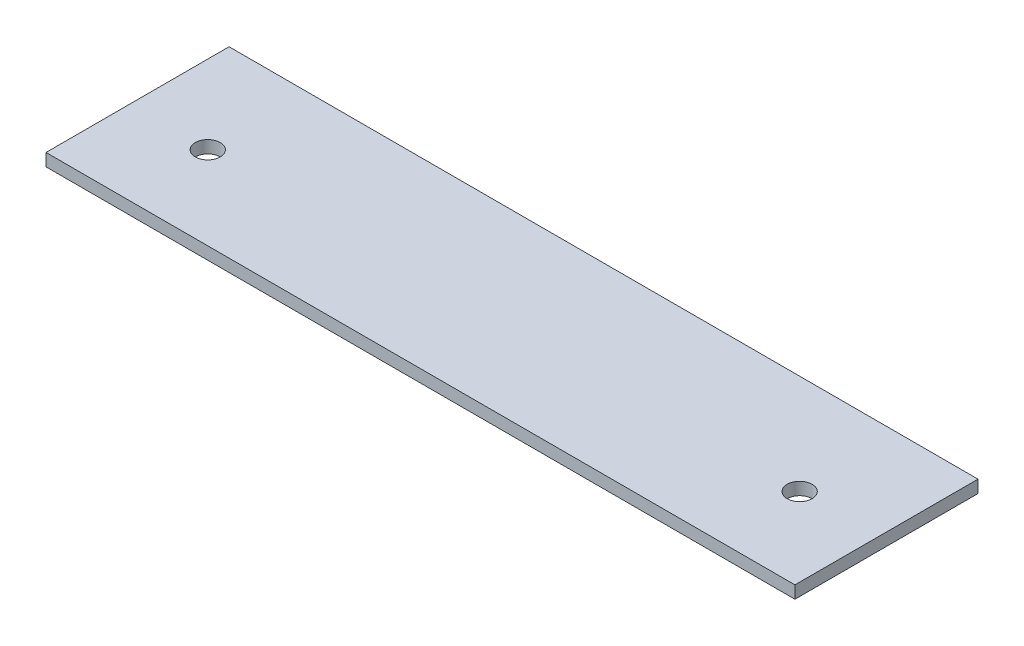
ISO-10303-21;
HEADER;
FILE_DESCRIPTION(('STEP AP214'),'2;1');
FILE_NAME('part.step','',(''),(''),'','','');
FILE_SCHEMA(('AUTOMOTIVE_DESIGN { 1 0 10303 214 1 1 1 1 }'));
ENDSEC;
DATA;
#1=APPLICATION_CONTEXT('core data for automotive mechanical design processes');
#2=APPLICATION_PROTOCOL_DEFINITION('international standard','automotive_design',2000,#1);
#3=PRODUCT_CONTEXT('',#1,'mechanical');
#4=PRODUCT('Part','Part','',(#3));
#5=PRODUCT_RELATED_PRODUCT_CATEGORY('part','',(#4));
#6=PRODUCT_DEFINITION_FORMATION('','',#4);
#7=PRODUCT_DEFINITION_CONTEXT('part definition',#1,'design');
#8=PRODUCT_DEFINITION('design','',#6,#7);
#9=PRODUCT_DEFINITION_SHAPE('','',#8);
#10=(LENGTH_UNIT() NAMED_UNIT(*) SI_UNIT(.MILLI.,.METRE.));
#11=(NAMED_UNIT(*) PLANE_ANGLE_UNIT() SI_UNIT($,.RADIAN.));
#12=(NAMED_UNIT(*) SI_UNIT($,.STERADIAN.) SOLID_ANGLE_UNIT());
#13=UNCERTAINTY_MEASURE_WITH_UNIT(LENGTH_MEASURE(1.E-05),#10,'distance_accuracy_value','');
#14=(GEOMETRIC_REPRESENTATION_CONTEXT(3) GLOBAL_UNCERTAINTY_ASSIGNED_CONTEXT((#13)) GLOBAL_UNIT_ASSIGNED_CONTEXT((#10,
#11,#12)) REPRESENTATION_CONTEXT('',''));
#15=CARTESIAN_POINT('',(0.,0.,0.));
#16=DIRECTION('',(0.,0.,1.));
#17=DIRECTION('',(1.,0.,0.));
#18=AXIS2_PLACEMENT_3D('',#15,#16,#17);
#19=CARTESIAN_POINT('',(0.,-1.5,11.));
#20=DIRECTION('',(0.,0.,1.));
#21=DIRECTION('',(1.,0.,0.));
#22=AXIS2_PLACEMENT_3D('',#19,#20,#21);
#23=PLANE('',#22);
#24=DIRECTION('',(1.,0.,0.));
#25=VECTOR('',#24,1.);
#26=CARTESIAN_POINT('',(0.,0.,11.));
#27=LINE('',#26,#25);
#28=CARTESIAN_POINT('',(-45.,0.,11.));
#29=VERTEX_POINT('',#28);
#30=CARTESIAN_POINT('',(45.,0.,11.));
#31=VERTEX_POINT('',#30);
#32=EDGE_CURVE('E112',#29,#31,#27,.T.);
#33=ORIENTED_EDGE('',*,*,#32,.F.);
#34=DIRECTION('',(0.,1.,0.));
#35=VECTOR('',#34,1.);
#36=CARTESIAN_POINT('',(-45.,-1.5,11.));
#37=LINE('',#36,#35);
#38=CARTESIAN_POINT('',(-45.,-1.5,11.));
#39=VERTEX_POINT('',#38);
#40=EDGE_CURVE('E11',#39,#29,#37,.T.);
#41=ORIENTED_EDGE('',*,*,#40,.F.);
#42=DIRECTION('',(1.,0.,0.));
#43=VECTOR('',#42,1.);
#44=CARTESIAN_POINT('',(0.,-1.5,11.));
#45=LINE('',#44,#43);
#46=CARTESIAN_POINT('',(45.,-1.5,11.));
#47=VERTEX_POINT('',#46);
#48=EDGE_CURVE('E100',#39,#47,#45,.T.);
#49=ORIENTED_EDGE('',*,*,#48,.T.);
#50=DIRECTION('',(0.,1.,0.));
#51=VECTOR('',#50,1.);
#52=CARTESIAN_POINT('',(45.,-1.5,11.));
#53=LINE('',#52,#51);
#54=EDGE_CURVE('E42',#47,#31,#53,.T.);
#55=ORIENTED_EDGE('',*,*,#54,.T.);
#56=EDGE_LOOP('',(#33,#41,#49,#55));
#57=FACE_BOUND('',#56,.T.);
#58=ADVANCED_FACE('F39',(#57),#23,.T.);
#59=CARTESIAN_POINT('',(-45.,-1.5,0.));
#60=DIRECTION('',(1.,0.,0.));
#61=DIRECTION('',(0.,0.,-1.));
#62=AXIS2_PLACEMENT_3D('',#59,#60,#61);
#63=PLANE('',#62);
#64=DIRECTION('',(0.,0.,-1.));
#65=VECTOR('',#64,1.);
#66=CARTESIAN_POINT('',(-45.,0.,0.));
#67=LINE('',#66,#65);
#68=CARTESIAN_POINT('',(-45.,0.,-11.));
#69=VERTEX_POINT('',#68);
#70=EDGE_CURVE('E72',#29,#69,#67,.T.);
#71=ORIENTED_EDGE('',*,*,#70,.T.);
#72=DIRECTION('',(0.,1.,0.));
#73=VECTOR('',#72,1.);
#74=CARTESIAN_POINT('',(-45.,-1.5,-11.));
#75=LINE('',#74,#73);
#76=CARTESIAN_POINT('',(-45.,-1.5,-11.));
#77=VERTEX_POINT('',#76);
#78=EDGE_CURVE('E48',#77,#69,#75,.T.);
#79=ORIENTED_EDGE('',*,*,#78,.F.);
#80=DIRECTION('',(0.,0.,-1.));
#81=VECTOR('',#80,1.);
#82=CARTESIAN_POINT('',(-45.,-1.5,0.));
#83=LINE('',#82,#81);
#84=EDGE_CURVE('E90',#39,#77,#83,.T.);
#85=ORIENTED_EDGE('',*,*,#84,.F.);
#86=ORIENTED_EDGE('',*,*,#40,.T.);
#87=EDGE_LOOP('',(#71,#79,#85,#86));
#88=FACE_BOUND('',#87,.T.);
#89=ADVANCED_FACE('F128',(#88),#63,.F.);
#90=CARTESIAN_POINT('',(0.,-1.5,-11.));
#91=DIRECTION('',(0.,0.,1.));
#92=DIRECTION('',(1.,0.,0.));
#93=AXIS2_PLACEMENT_3D('',#90,#91,#92);
#94=PLANE('',#93);
#95=DIRECTION('',(1.,0.,0.));
#96=VECTOR('',#95,1.);
#97=CARTESIAN_POINT('',(0.,0.,-11.));
#98=LINE('',#97,#96);
#99=CARTESIAN_POINT('',(45.,0.,-11.));
#100=VERTEX_POINT('',#99);
#101=EDGE_CURVE('E97',#69,#100,#98,.T.);
#102=ORIENTED_EDGE('',*,*,#101,.T.);
#103=DIRECTION('',(0.,1.,0.));
#104=VECTOR('',#103,1.);
#105=CARTESIAN_POINT('',(45.,-1.5,-11.));
#106=LINE('',#105,#104);
#107=CARTESIAN_POINT('',(45.,-1.5,-11.));
#108=VERTEX_POINT('',#107);
#109=EDGE_CURVE('E94',#108,#100,#106,.T.);
#110=ORIENTED_EDGE('',*,*,#109,.F.);
#111=DIRECTION('',(1.,0.,0.));
#112=VECTOR('',#111,1.);
#113=CARTESIAN_POINT('',(0.,-1.5,-11.));
#114=LINE('',#113,#112);
#115=EDGE_CURVE('E84',#77,#108,#114,.T.);
#116=ORIENTED_EDGE('',*,*,#115,.F.);
#117=ORIENTED_EDGE('',*,*,#78,.T.);
#118=EDGE_LOOP('',(#102,#110,#116,#117));
#119=FACE_BOUND('',#118,.T.);
#120=ADVANCED_FACE('F95',(#119),#94,.F.);
#121=CARTESIAN_POINT('',(35.565,-1.5,0.999999999999978));
#122=DIRECTION('',(0.,1.,0.));
#123=DIRECTION('',(0.,0.,1.));
#124=AXIS2_PLACEMENT_3D('',#121,#122,#123);
#125=CYLINDRICAL_SURFACE('',#124,1.5);
#126=CARTESIAN_POINT('',(35.565,-1.5,0.999999999999978));
#127=DIRECTION('',(0.,1.,0.));
#128=DIRECTION('',(0.,0.,1.));
#129=AXIS2_PLACEMENT_3D('',#126,#127,#128);
#130=CIRCLE('',#129,1.5);
#131=CARTESIAN_POINT('',(35.565,-1.5,2.49999999999998));
#132=VERTEX_POINT('',#131);
#133=EDGE_CURVE('E106',#132,#132,#130,.T.);
#134=ORIENTED_EDGE('',*,*,#133,.F.);
#135=EDGE_LOOP('',(#134));
#136=FACE_BOUND('',#135,.T.);
#137=CARTESIAN_POINT('',(35.565,0.,0.999999999999978));
#138=DIRECTION('',(0.,1.,0.));
#139=DIRECTION('',(0.,0.,1.));
#140=AXIS2_PLACEMENT_3D('',#137,#138,#139);
#141=CIRCLE('',#140,1.5);
#142=CARTESIAN_POINT('',(35.565,0.,2.49999999999998));
#143=VERTEX_POINT('',#142);
#144=EDGE_CURVE('E119',#143,#143,#141,.T.);
#145=ORIENTED_EDGE('',*,*,#144,.T.);
#146=EDGE_LOOP('',(#145));
#147=FACE_BOUND('',#146,.T.);
#148=ADVANCED_FACE('F136',(#136,#147),#125,.F.);
#149=CARTESIAN_POINT('',(45.,-1.5,0.));
#150=DIRECTION('',(1.,0.,0.));
#151=DIRECTION('',(0.,0.,-1.));
#152=AXIS2_PLACEMENT_3D('',#149,#150,#151);
#153=PLANE('',#152);
#154=DIRECTION('',(0.,0.,-1.));
#155=VECTOR('',#154,1.);
#156=CARTESIAN_POINT('',(45.,0.,0.));
#157=LINE('',#156,#155);
#158=EDGE_CURVE('E115',#31,#100,#157,.T.);
#159=ORIENTED_EDGE('',*,*,#158,.F.);
#160=ORIENTED_EDGE('',*,*,#54,.F.);
#161=DIRECTION('',(0.,0.,-1.));
#162=VECTOR('',#161,1.);
#163=CARTESIAN_POINT('',(45.,-1.5,0.));
#164=LINE('',#163,#162);
#165=EDGE_CURVE('E89',#47,#108,#164,.T.);
#166=ORIENTED_EDGE('',*,*,#165,.T.);
#167=ORIENTED_EDGE('',*,*,#109,.T.);
#168=EDGE_LOOP('',(#159,#160,#166,#167));
#169=FACE_BOUND('',#168,.T.);
#170=ADVANCED_FACE('F99',(#169),#153,.T.);
#171=CARTESIAN_POINT('',(-35.565,-1.5,0.999999999999987));
#172=DIRECTION('',(0.,1.,0.));
#173=DIRECTION('',(0.,0.,1.));
#174=AXIS2_PLACEMENT_3D('',#171,#172,#173);
#175=CYLINDRICAL_SURFACE('',#174,1.5);
#176=CARTESIAN_POINT('',(-35.565,-1.5,0.999999999999987));
#177=DIRECTION('',(0.,1.,0.));
#178=DIRECTION('',(0.,0.,1.));
#179=AXIS2_PLACEMENT_3D('',#176,#177,#178);
#180=CIRCLE('',#179,1.5);
#181=CARTESIAN_POINT('',(-35.565,-1.5,2.49999999999999));
#182=VERTEX_POINT('',#181);
#183=EDGE_CURVE('E109',#182,#182,#180,.F.);
#184=ORIENTED_EDGE('',*,*,#183,.T.);
#185=EDGE_LOOP('',(#184));
#186=FACE_BOUND('',#185,.T.);
#187=CARTESIAN_POINT('',(-35.565,0.,0.999999999999987));
#188=DIRECTION('',(0.,1.,0.));
#189=DIRECTION('',(0.,0.,1.));
#190=AXIS2_PLACEMENT_3D('',#187,#188,#189);
#191=CIRCLE('',#190,1.5);
#192=CARTESIAN_POINT('',(-35.565,0.,2.49999999999999));
#193=VERTEX_POINT('',#192);
#194=EDGE_CURVE('E102',#193,#193,#191,.F.);
#195=ORIENTED_EDGE('',*,*,#194,.F.);
#196=EDGE_LOOP('',(#195));
#197=FACE_BOUND('',#196,.T.);
#198=ADVANCED_FACE('F141',(#186,#197),#175,.F.);
#199=CARTESIAN_POINT('',(0.,-1.5,0.));
#200=DIRECTION('',(0.,1.,0.));
#201=DIRECTION('',(0.,0.,1.));
#202=AXIS2_PLACEMENT_3D('',#199,#200,#201);
#203=PLANE('',#202);
#204=ORIENTED_EDGE('',*,*,#48,.F.);
#205=ORIENTED_EDGE('',*,*,#84,.T.);
#206=ORIENTED_EDGE('',*,*,#115,.T.);
#207=ORIENTED_EDGE('',*,*,#165,.F.);
#208=EDGE_LOOP('',(#204,#205,#206,#207));
#209=FACE_BOUND('',#208,.T.);
#210=ORIENTED_EDGE('',*,*,#133,.T.);
#211=EDGE_LOOP('',(#210));
#212=FACE_BOUND('',#211,.T.);
#213=ORIENTED_EDGE('',*,*,#183,.F.);
#214=EDGE_LOOP('',(#213));
#215=FACE_BOUND('',#214,.T.);
#216=ADVANCED_FACE('F87',(#209,#212,#215),#203,.F.);
#217=CARTESIAN_POINT('',(0.,0.,0.));
#218=DIRECTION('',(0.,1.,0.));
#219=DIRECTION('',(0.,0.,1.));
#220=AXIS2_PLACEMENT_3D('',#217,#218,#219);
#221=PLANE('',#220);
#222=ORIENTED_EDGE('',*,*,#32,.T.);
#223=ORIENTED_EDGE('',*,*,#158,.T.);
#224=ORIENTED_EDGE('',*,*,#101,.F.);
#225=ORIENTED_EDGE('',*,*,#70,.F.);
#226=EDGE_LOOP('',(#222,#223,#224,#225));
#227=FACE_BOUND('',#226,.T.);
#228=ORIENTED_EDGE('',*,*,#144,.F.);
#229=EDGE_LOOP('',(#228));
#230=FACE_BOUND('',#229,.T.);
#231=ORIENTED_EDGE('',*,*,#194,.T.);
#232=EDGE_LOOP('',(#231));
#233=FACE_BOUND('',#232,.T.);
#234=ADVANCED_FACE('F125',(#227,#230,#233),#221,.T.);
#235=CLOSED_SHELL('',(#58,#89,#120,#148,#170,#198,#216,#234));
#236=MANIFOLD_SOLID_BREP('B2',#235);
#237=ADVANCED_BREP_SHAPE_REPRESENTATION('',(#18,#236),#14);
#238=SHAPE_DEFINITION_REPRESENTATION(#9,#237);
ENDSEC;
END-ISO-10303-21;
